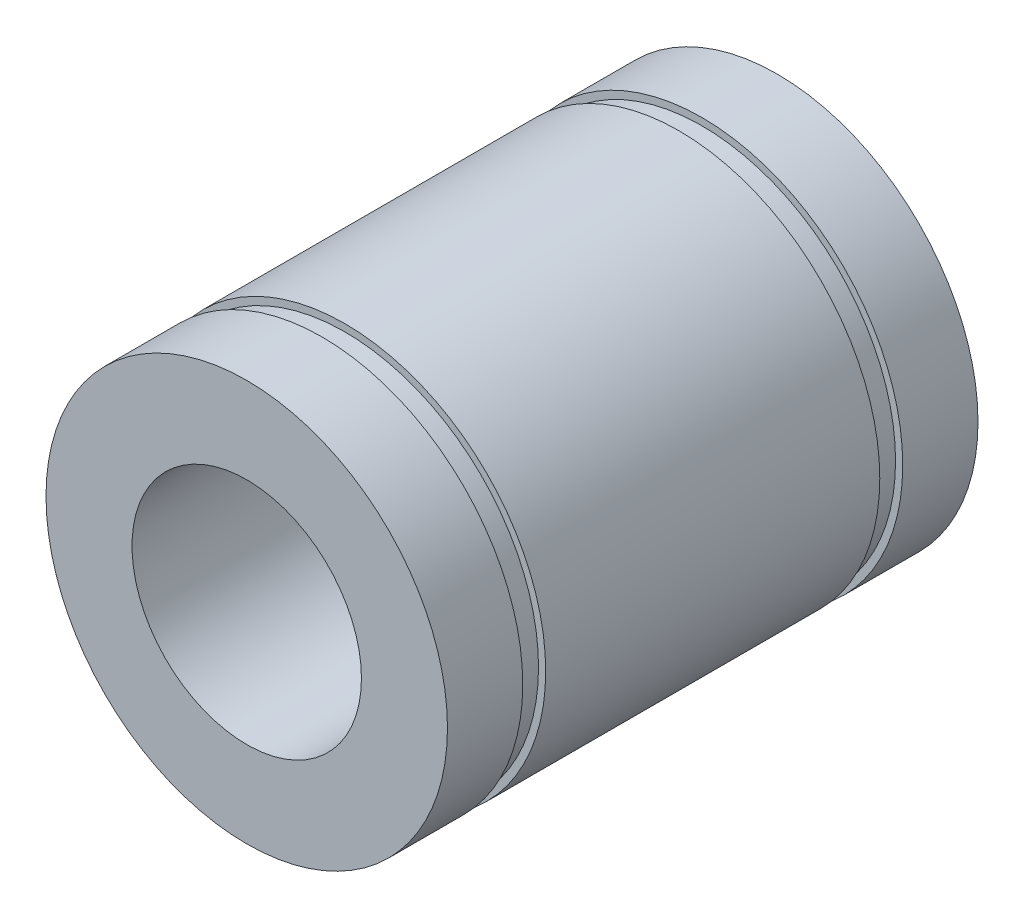
ISO-10303-21;
HEADER;
FILE_DESCRIPTION(('STEP AP214'),'2;1');
FILE_NAME('part.step','',(''),(''),'','','');
FILE_SCHEMA(('AUTOMOTIVE_DESIGN { 1 0 10303 214 1 1 1 1 }'));
ENDSEC;
DATA;
#1=APPLICATION_CONTEXT('core data for automotive mechanical design processes');
#2=APPLICATION_PROTOCOL_DEFINITION('international standard','automotive_design',2000,#1);
#3=PRODUCT_CONTEXT('',#1,'mechanical');
#4=PRODUCT('Part','Part','',(#3));
#5=PRODUCT_RELATED_PRODUCT_CATEGORY('part','',(#4));
#6=PRODUCT_DEFINITION_FORMATION('','',#4);
#7=PRODUCT_DEFINITION_CONTEXT('part definition',#1,'design');
#8=PRODUCT_DEFINITION('design','',#6,#7);
#9=PRODUCT_DEFINITION_SHAPE('','',#8);
#10=(LENGTH_UNIT() NAMED_UNIT(*) SI_UNIT(.MILLI.,.METRE.));
#11=(NAMED_UNIT(*) PLANE_ANGLE_UNIT() SI_UNIT($,.RADIAN.));
#12=(NAMED_UNIT(*) SI_UNIT($,.STERADIAN.) SOLID_ANGLE_UNIT());
#13=UNCERTAINTY_MEASURE_WITH_UNIT(LENGTH_MEASURE(1.E-05),#10,'distance_accuracy_value','');
#14=(GEOMETRIC_REPRESENTATION_CONTEXT(3) GLOBAL_UNCERTAINTY_ASSIGNED_CONTEXT((#13)) GLOBAL_UNIT_ASSIGNED_CONTEXT((#10,
#11,#12)) REPRESENTATION_CONTEXT('',''));
#15=CARTESIAN_POINT('',(0.,0.,0.));
#16=DIRECTION('',(0.,0.,1.));
#17=DIRECTION('',(1.,0.,0.));
#18=AXIS2_PLACEMENT_3D('',#15,#16,#17);
#19=CARTESIAN_POINT('',(0.,0.,18.5));
#20=DIRECTION('',(0.,0.,-1.));
#21=DIRECTION('',(-1.,0.,0.));
#22=AXIS2_PLACEMENT_3D('',#19,#20,#21);
#23=CYLINDRICAL_SURFACE('',#22,14.);
#24=CARTESIAN_POINT('',(0.,0.,11.65));
#25=DIRECTION('',(0.,0.,1.));
#26=DIRECTION('',(1.,0.,0.));
#27=AXIS2_PLACEMENT_3D('',#24,#25,#26);
#28=CIRCLE('',#27,14.);
#29=CARTESIAN_POINT('',(14.,0.,11.65));
#30=VERTEX_POINT('',#29);
#31=EDGE_CURVE('E79',#30,#30,#28,.T.);
#32=ORIENTED_EDGE('',*,*,#31,.F.);
#33=EDGE_LOOP('',(#32));
#34=FACE_BOUND('',#33,.T.);
#35=CARTESIAN_POINT('',(0.,0.,-11.65));
#36=DIRECTION('',(0.,0.,1.));
#37=DIRECTION('',(1.,0.,0.));
#38=AXIS2_PLACEMENT_3D('',#35,#36,#37);
#39=CIRCLE('',#38,14.);
#40=CARTESIAN_POINT('',(14.,0.,-11.65));
#41=VERTEX_POINT('',#40);
#42=EDGE_CURVE('E71',#41,#41,#39,.T.);
#43=ORIENTED_EDGE('',*,*,#42,.T.);
#44=EDGE_LOOP('',(#43));
#45=FACE_BOUND('',#44,.T.);
#46=ADVANCED_FACE('F39',(#34,#45),#23,.T.);
#47=CARTESIAN_POINT('',(0.,0.,-13.25));
#48=DIRECTION('',(0.,0.,1.));
#49=DIRECTION('',(1.,0.,0.));
#50=AXIS2_PLACEMENT_3D('',#47,#48,#49);
#51=CIRCLE('',#50,14.);
#52=CARTESIAN_POINT('',(14.,0.,-13.25));
#53=VERTEX_POINT('',#52);
#54=EDGE_CURVE('E58',#53,#53,#51,.T.);
#55=ORIENTED_EDGE('',*,*,#54,.F.);
#56=EDGE_LOOP('',(#55));
#57=FACE_BOUND('',#56,.T.);
#58=CARTESIAN_POINT('',(0.,0.,-18.5));
#59=DIRECTION('',(0.,0.,1.));
#60=DIRECTION('',(1.,0.,0.));
#61=AXIS2_PLACEMENT_3D('',#58,#59,#60);
#62=CIRCLE('',#61,14.);
#63=CARTESIAN_POINT('',(14.,0.,-18.5));
#64=VERTEX_POINT('',#63);
#65=EDGE_CURVE('E43',#64,#64,#62,.T.);
#66=ORIENTED_EDGE('',*,*,#65,.T.);
#67=EDGE_LOOP('',(#66));
#68=FACE_BOUND('',#67,.T.);
#69=ADVANCED_FACE('F108',(#57,#68),#23,.T.);
#70=CARTESIAN_POINT('',(0.,0.,18.5));
#71=DIRECTION('',(0.,0.,1.));
#72=DIRECTION('',(1.,0.,0.));
#73=AXIS2_PLACEMENT_3D('',#70,#71,#72);
#74=PLANE('',#73);
#75=CARTESIAN_POINT('',(0.,0.,18.5));
#76=DIRECTION('',(0.,0.,1.));
#77=DIRECTION('',(1.,0.,0.));
#78=AXIS2_PLACEMENT_3D('',#75,#76,#77);
#79=CIRCLE('',#78,14.);
#80=CARTESIAN_POINT('',(14.,0.,18.5));
#81=VERTEX_POINT('',#80);
#82=EDGE_CURVE('E10',#81,#81,#79,.T.);
#83=ORIENTED_EDGE('',*,*,#82,.T.);
#84=EDGE_LOOP('',(#83));
#85=FACE_BOUND('',#84,.T.);
#86=CARTESIAN_POINT('',(0.,0.,18.5));
#87=DIRECTION('',(0.,0.,1.));
#88=DIRECTION('',(1.,0.,0.));
#89=AXIS2_PLACEMENT_3D('',#86,#87,#88);
#90=CIRCLE('',#89,8.);
#91=CARTESIAN_POINT('',(8.,0.,18.5));
#92=VERTEX_POINT('',#91);
#93=EDGE_CURVE('E53',#92,#92,#90,.T.);
#94=ORIENTED_EDGE('',*,*,#93,.F.);
#95=EDGE_LOOP('',(#94));
#96=FACE_BOUND('',#95,.T.);
#97=ADVANCED_FACE('F131',(#85,#96),#74,.T.);
#98=CARTESIAN_POINT('',(0.,0.,-18.5));
#99=DIRECTION('',(0.,0.,1.));
#100=DIRECTION('',(1.,0.,0.));
#101=AXIS2_PLACEMENT_3D('',#98,#99,#100);
#102=PLANE('',#101);
#103=ORIENTED_EDGE('',*,*,#65,.F.);
#104=EDGE_LOOP('',(#103));
#105=FACE_BOUND('',#104,.T.);
#106=CARTESIAN_POINT('',(0.,0.,-18.5));
#107=DIRECTION('',(0.,0.,1.));
#108=DIRECTION('',(1.,0.,0.));
#109=AXIS2_PLACEMENT_3D('',#106,#107,#108);
#110=CIRCLE('',#109,8.);
#111=CARTESIAN_POINT('',(8.,0.,-18.5));
#112=VERTEX_POINT('',#111);
#113=EDGE_CURVE('E55',#112,#112,#110,.T.);
#114=ORIENTED_EDGE('',*,*,#113,.T.);
#115=EDGE_LOOP('',(#114));
#116=FACE_BOUND('',#115,.T.);
#117=ADVANCED_FACE('F134',(#105,#116),#102,.F.);
#118=CARTESIAN_POINT('',(0.,0.,13.25));
#119=DIRECTION('',(0.,0.,1.));
#120=DIRECTION('',(1.,0.,0.));
#121=AXIS2_PLACEMENT_3D('',#118,#119,#120);
#122=CIRCLE('',#121,14.);
#123=CARTESIAN_POINT('',(14.,0.,13.25));
#124=VERTEX_POINT('',#123);
#125=EDGE_CURVE('E83',#124,#124,#122,.T.);
#126=ORIENTED_EDGE('',*,*,#125,.T.);
#127=EDGE_LOOP('',(#126));
#128=FACE_BOUND('',#127,.T.);
#129=ORIENTED_EDGE('',*,*,#82,.F.);
#130=EDGE_LOOP('',(#129));
#131=FACE_BOUND('',#130,.T.);
#132=ADVANCED_FACE('F41',(#128,#131),#23,.T.);
#133=CARTESIAN_POINT('',(0.,0.,18.5));
#134=DIRECTION('',(0.,0.,-1.));
#135=DIRECTION('',(-1.,0.,0.));
#136=AXIS2_PLACEMENT_3D('',#133,#134,#135);
#137=CYLINDRICAL_SURFACE('',#136,8.);
#138=ORIENTED_EDGE('',*,*,#93,.T.);
#139=EDGE_LOOP('',(#138));
#140=FACE_BOUND('',#139,.T.);
#141=ORIENTED_EDGE('',*,*,#113,.F.);
#142=EDGE_LOOP('',(#141));
#143=FACE_BOUND('',#142,.T.);
#144=ADVANCED_FACE('F125',(#140,#143),#137,.F.);
#145=CARTESIAN_POINT('',(13.5,0.,-13.25));
#146=DIRECTION('',(0.,0.,-1.));
#147=DIRECTION('',(-1.,0.,0.));
#148=AXIS2_PLACEMENT_3D('',#145,#146,#147);
#149=PLANE('',#148);
#150=CARTESIAN_POINT('',(0.,0.,-13.25));
#151=DIRECTION('',(0.,0.,1.));
#152=DIRECTION('',(1.,0.,0.));
#153=AXIS2_PLACEMENT_3D('',#150,#151,#152);
#154=CIRCLE('',#153,13.5);
#155=CARTESIAN_POINT('',(13.5,0.,-13.25));
#156=VERTEX_POINT('',#155);
#157=EDGE_CURVE('E64',#156,#156,#154,.T.);
#158=ORIENTED_EDGE('',*,*,#157,.F.);
#159=EDGE_LOOP('',(#158));
#160=FACE_BOUND('',#159,.T.);
#161=ORIENTED_EDGE('',*,*,#54,.T.);
#162=EDGE_LOOP('',(#161));
#163=FACE_BOUND('',#162,.T.);
#164=ADVANCED_FACE('F119',(#160,#163),#149,.F.);
#165=CARTESIAN_POINT('',(0.,0.,18.5));
#166=DIRECTION('',(0.,0.,1.));
#167=DIRECTION('',(1.,0.,0.));
#168=AXIS2_PLACEMENT_3D('',#165,#166,#167);
#169=CYLINDRICAL_SURFACE('',#168,13.5);
#170=CARTESIAN_POINT('',(0.,0.,-11.65));
#171=DIRECTION('',(0.,0.,1.));
#172=DIRECTION('',(1.,0.,0.));
#173=AXIS2_PLACEMENT_3D('',#170,#171,#172);
#174=CIRCLE('',#173,13.5);
#175=CARTESIAN_POINT('',(13.5,0.,-11.65));
#176=VERTEX_POINT('',#175);
#177=EDGE_CURVE('E68',#176,#176,#174,.T.);
#178=ORIENTED_EDGE('',*,*,#177,.F.);
#179=EDGE_LOOP('',(#178));
#180=FACE_BOUND('',#179,.T.);
#181=ORIENTED_EDGE('',*,*,#157,.T.);
#182=EDGE_LOOP('',(#181));
#183=FACE_BOUND('',#182,.T.);
#184=ADVANCED_FACE('F113',(#180,#183),#169,.T.);
#185=CARTESIAN_POINT('',(13.5,0.,-11.65));
#186=DIRECTION('',(0.,0.,1.));
#187=DIRECTION('',(1.,0.,0.));
#188=AXIS2_PLACEMENT_3D('',#185,#186,#187);
#189=PLANE('',#188);
#190=ORIENTED_EDGE('',*,*,#42,.F.);
#191=EDGE_LOOP('',(#190));
#192=FACE_BOUND('',#191,.T.);
#193=ORIENTED_EDGE('',*,*,#177,.T.);
#194=EDGE_LOOP('',(#193));
#195=FACE_BOUND('',#194,.T.);
#196=ADVANCED_FACE('F97',(#192,#195),#189,.F.);
#197=CARTESIAN_POINT('',(0.,0.,18.5));
#198=DIRECTION('',(0.,0.,1.));
#199=DIRECTION('',(1.,0.,0.));
#200=AXIS2_PLACEMENT_3D('',#197,#198,#199);
#201=CYLINDRICAL_SURFACE('',#200,13.5);
#202=CARTESIAN_POINT('',(0.,0.,13.25));
#203=DIRECTION('',(0.,0.,1.));
#204=DIRECTION('',(1.,0.,0.));
#205=AXIS2_PLACEMENT_3D('',#202,#203,#204);
#206=CIRCLE('',#205,13.5);
#207=CARTESIAN_POINT('',(13.5,0.,13.25));
#208=VERTEX_POINT('',#207);
#209=EDGE_CURVE('E86',#208,#208,#206,.T.);
#210=ORIENTED_EDGE('',*,*,#209,.F.);
#211=EDGE_LOOP('',(#210));
#212=FACE_BOUND('',#211,.T.);
#213=CARTESIAN_POINT('',(0.,0.,11.65));
#214=DIRECTION('',(0.,0.,1.));
#215=DIRECTION('',(1.,0.,0.));
#216=AXIS2_PLACEMENT_3D('',#213,#214,#215);
#217=CIRCLE('',#216,13.5);
#218=CARTESIAN_POINT('',(13.5,0.,11.65));
#219=VERTEX_POINT('',#218);
#220=EDGE_CURVE('E75',#219,#219,#217,.T.);
#221=ORIENTED_EDGE('',*,*,#220,.T.);
#222=EDGE_LOOP('',(#221));
#223=FACE_BOUND('',#222,.T.);
#224=ADVANCED_FACE('F93',(#212,#223),#201,.T.);
#225=CARTESIAN_POINT('',(13.5,0.,11.65));
#226=DIRECTION('',(0.,0.,-1.));
#227=DIRECTION('',(-1.,0.,0.));
#228=AXIS2_PLACEMENT_3D('',#225,#226,#227);
#229=PLANE('',#228);
#230=ORIENTED_EDGE('',*,*,#220,.F.);
#231=EDGE_LOOP('',(#230));
#232=FACE_BOUND('',#231,.T.);
#233=ORIENTED_EDGE('',*,*,#31,.T.);
#234=EDGE_LOOP('',(#233));
#235=FACE_BOUND('',#234,.T.);
#236=ADVANCED_FACE('F96',(#232,#235),#229,.F.);
#237=CARTESIAN_POINT('',(13.5,0.,13.25));
#238=DIRECTION('',(0.,0.,1.));
#239=DIRECTION('',(1.,0.,0.));
#240=AXIS2_PLACEMENT_3D('',#237,#238,#239);
#241=PLANE('',#240);
#242=ORIENTED_EDGE('',*,*,#125,.F.);
#243=EDGE_LOOP('',(#242));
#244=FACE_BOUND('',#243,.T.);
#245=ORIENTED_EDGE('',*,*,#209,.T.);
#246=EDGE_LOOP('',(#245));
#247=FACE_BOUND('',#246,.T.);
#248=ADVANCED_FACE('F91',(#244,#247),#241,.F.);
#249=CLOSED_SHELL('',(#46,#69,#97,#117,#132,#144,#164,#184,#196,#224,#236,#248));
#250=MANIFOLD_SOLID_BREP('B2',#249);
#251=ADVANCED_BREP_SHAPE_REPRESENTATION('',(#18,#250),#14);
#252=SHAPE_DEFINITION_REPRESENTATION(#9,#251);
ENDSEC;
END-ISO-10303-21;
